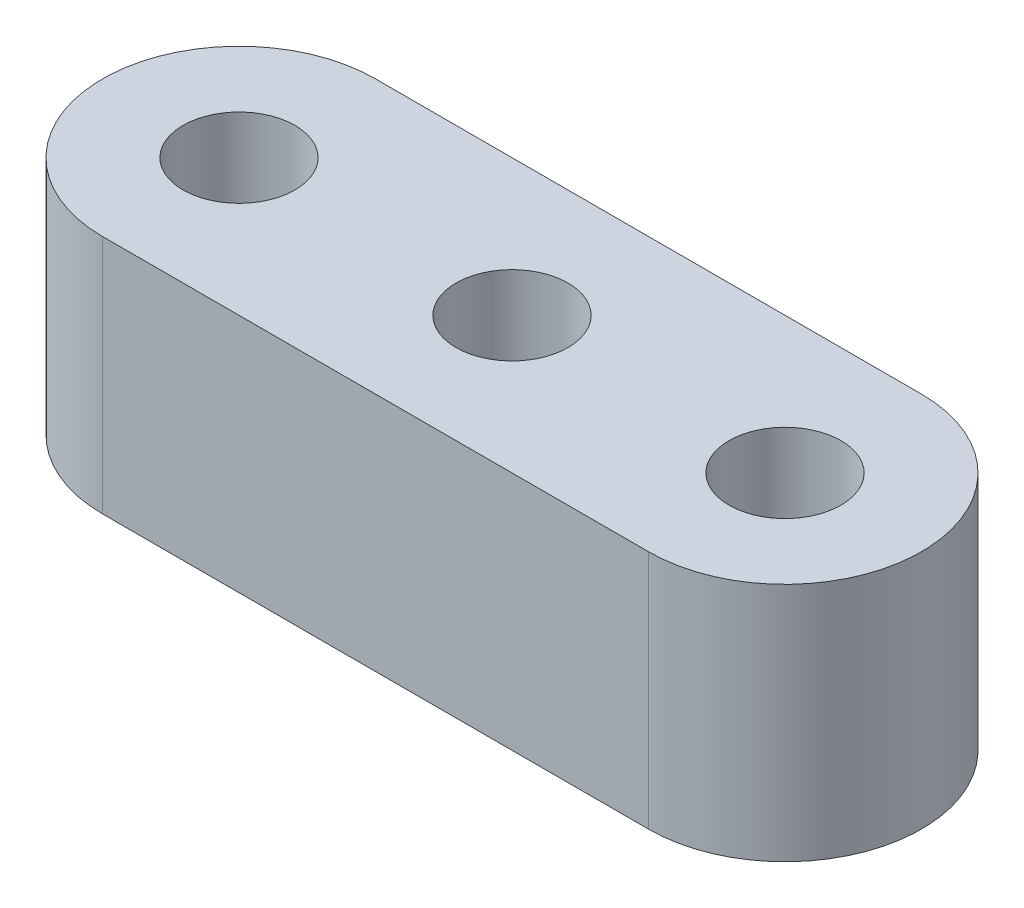
ISO-10303-21;
HEADER;
FILE_DESCRIPTION(('STEP AP214'),'2;1');
FILE_NAME('part.step','',(''),(''),'','','');
FILE_SCHEMA(('AUTOMOTIVE_DESIGN { 1 0 10303 214 1 1 1 1 }'));
ENDSEC;
DATA;
#1=APPLICATION_CONTEXT('core data for automotive mechanical design processes');
#2=APPLICATION_PROTOCOL_DEFINITION('international standard','automotive_design',2000,#1);
#3=PRODUCT_CONTEXT('',#1,'mechanical');
#4=PRODUCT('Part','Part','',(#3));
#5=PRODUCT_RELATED_PRODUCT_CATEGORY('part','',(#4));
#6=PRODUCT_DEFINITION_FORMATION('','',#4);
#7=PRODUCT_DEFINITION_CONTEXT('part definition',#1,'design');
#8=PRODUCT_DEFINITION('design','',#6,#7);
#9=PRODUCT_DEFINITION_SHAPE('','',#8);
#10=(LENGTH_UNIT() NAMED_UNIT(*) SI_UNIT(.MILLI.,.METRE.));
#11=(NAMED_UNIT(*) PLANE_ANGLE_UNIT() SI_UNIT($,.RADIAN.));
#12=(NAMED_UNIT(*) SI_UNIT($,.STERADIAN.) SOLID_ANGLE_UNIT());
#13=UNCERTAINTY_MEASURE_WITH_UNIT(LENGTH_MEASURE(1.E-05),#10,'distance_accuracy_value','');
#14=(GEOMETRIC_REPRESENTATION_CONTEXT(3) GLOBAL_UNCERTAINTY_ASSIGNED_CONTEXT((#13)) GLOBAL_UNIT_ASSIGNED_CONTEXT((#10,
#11,#12)) REPRESENTATION_CONTEXT('',''));
#15=CARTESIAN_POINT('',(0.,0.,0.));
#16=DIRECTION('',(0.,0.,1.));
#17=DIRECTION('',(1.,0.,0.));
#18=AXIS2_PLACEMENT_3D('',#15,#16,#17);
#19=CARTESIAN_POINT('',(-10.,4.4,5.));
#20=DIRECTION('',(0.,1.,0.));
#21=DIRECTION('',(0.,0.,1.));
#22=AXIS2_PLACEMENT_3D('',#19,#20,#21);
#23=PLANE('',#22);
#24=CARTESIAN_POINT('',(-10.,4.4,5.));
#25=DIRECTION('',(0.,1.,0.));
#26=DIRECTION('',(0.,0.,-1.));
#27=AXIS2_PLACEMENT_3D('',#24,#25,#26);
#28=CIRCLE('',#27,2.05);
#29=CARTESIAN_POINT('',(-10.,4.4,2.95));
#30=VERTEX_POINT('',#29);
#31=EDGE_CURVE('E136',#30,#30,#28,.T.);
#32=ORIENTED_EDGE('',*,*,#31,.F.);
#33=EDGE_LOOP('',(#32));
#34=FACE_BOUND('',#33,.T.);
#35=CARTESIAN_POINT('',(-10.,4.4,5.));
#36=DIRECTION('',(0.,1.,0.));
#37=DIRECTION('',(0.,0.,1.));
#38=AXIS2_PLACEMENT_3D('',#35,#36,#37);
#39=CIRCLE('',#38,5.);
#40=CARTESIAN_POINT('',(-10.,4.4,0.));
#41=VERTEX_POINT('',#40);
#42=CARTESIAN_POINT('',(-10.,4.4,10.));
#43=VERTEX_POINT('',#42);
#44=EDGE_CURVE('E95',#41,#43,#39,.T.);
#45=ORIENTED_EDGE('',*,*,#44,.T.);
#46=DIRECTION('',(1.,0.,0.));
#47=VECTOR('',#46,1.);
#48=CARTESIAN_POINT('',(-10.,4.4,10.));
#49=LINE('',#48,#47);
#50=CARTESIAN_POINT('',(10.,4.4,10.));
#51=VERTEX_POINT('',#50);
#52=EDGE_CURVE('E89',#43,#51,#49,.T.);
#53=ORIENTED_EDGE('',*,*,#52,.T.);
#54=CARTESIAN_POINT('',(10.,4.4,5.));
#55=DIRECTION('',(0.,1.,0.));
#56=DIRECTION('',(0.,0.,1.));
#57=AXIS2_PLACEMENT_3D('',#54,#55,#56);
#58=CIRCLE('',#57,5.);
#59=CARTESIAN_POINT('',(10.,4.4,0.));
#60=VERTEX_POINT('',#59);
#61=EDGE_CURVE('E92',#51,#60,#58,.T.);
#62=ORIENTED_EDGE('',*,*,#61,.T.);
#63=DIRECTION('',(-1.,0.,0.));
#64=VECTOR('',#63,1.);
#65=CARTESIAN_POINT('',(5.,4.4,0.));
#66=LINE('',#65,#64);
#67=EDGE_CURVE('E61',#60,#41,#66,.T.);
#68=ORIENTED_EDGE('',*,*,#67,.T.);
#69=EDGE_LOOP('',(#45,#53,#62,#68));
#70=FACE_BOUND('',#69,.T.);
#71=CARTESIAN_POINT('',(10.,4.4,5.));
#72=DIRECTION('',(0.,1.,0.));
#73=DIRECTION('',(0.,0.,1.));
#74=AXIS2_PLACEMENT_3D('',#71,#72,#73);
#75=CIRCLE('',#74,2.05);
#76=CARTESIAN_POINT('',(10.,4.4,7.05));
#77=VERTEX_POINT('',#76);
#78=EDGE_CURVE('E117',#77,#77,#75,.T.);
#79=ORIENTED_EDGE('',*,*,#78,.F.);
#80=EDGE_LOOP('',(#79));
#81=FACE_BOUND('',#80,.T.);
#82=CARTESIAN_POINT('',(0.,4.4,5.));
#83=DIRECTION('',(0.,1.,0.));
#84=DIRECTION('',(0.,0.,1.));
#85=AXIS2_PLACEMENT_3D('',#82,#83,#84);
#86=CIRCLE('',#85,2.05);
#87=CARTESIAN_POINT('',(0.,4.4,7.05));
#88=VERTEX_POINT('',#87);
#89=EDGE_CURVE('E144',#88,#88,#86,.T.);
#90=ORIENTED_EDGE('',*,*,#89,.F.);
#91=EDGE_LOOP('',(#90));
#92=FACE_BOUND('',#91,.T.);
#93=ADVANCED_FACE('F43',(#34,#70,#81,#92),#23,.T.);
#94=CARTESIAN_POINT('',(-10.,-4.4,5.));
#95=DIRECTION('',(0.,1.,0.));
#96=DIRECTION('',(0.,0.,1.));
#97=AXIS2_PLACEMENT_3D('',#94,#95,#96);
#98=PLANE('',#97);
#99=CARTESIAN_POINT('',(-10.,-4.4,5.));
#100=DIRECTION('',(0.,1.,0.));
#101=DIRECTION('',(0.,0.,1.));
#102=AXIS2_PLACEMENT_3D('',#99,#100,#101);
#103=CIRCLE('',#102,5.);
#104=CARTESIAN_POINT('',(-10.,-4.4,0.));
#105=VERTEX_POINT('',#104);
#106=CARTESIAN_POINT('',(-10.,-4.4,10.));
#107=VERTEX_POINT('',#106);
#108=EDGE_CURVE('E113',#105,#107,#103,.T.);
#109=ORIENTED_EDGE('',*,*,#108,.F.);
#110=DIRECTION('',(-1.,0.,0.));
#111=VECTOR('',#110,1.);
#112=CARTESIAN_POINT('',(-10.,-4.4,0.));
#113=LINE('',#112,#111);
#114=CARTESIAN_POINT('',(10.,-4.4,0.));
#115=VERTEX_POINT('',#114);
#116=EDGE_CURVE('E78',#115,#105,#113,.T.);
#117=ORIENTED_EDGE('',*,*,#116,.F.);
#118=CARTESIAN_POINT('',(10.,-4.4,5.));
#119=DIRECTION('',(0.,1.,0.));
#120=DIRECTION('',(0.,0.,1.));
#121=AXIS2_PLACEMENT_3D('',#118,#119,#120);
#122=CIRCLE('',#121,5.);
#123=CARTESIAN_POINT('',(10.,-4.4,10.));
#124=VERTEX_POINT('',#123);
#125=EDGE_CURVE('E120',#124,#115,#122,.T.);
#126=ORIENTED_EDGE('',*,*,#125,.F.);
#127=DIRECTION('',(1.,0.,0.));
#128=VECTOR('',#127,1.);
#129=CARTESIAN_POINT('',(5.,-4.4,10.));
#130=LINE('',#129,#128);
#131=EDGE_CURVE('E101',#107,#124,#130,.T.);
#132=ORIENTED_EDGE('',*,*,#131,.F.);
#133=EDGE_LOOP('',(#109,#117,#126,#132));
#134=FACE_BOUND('',#133,.T.);
#135=CARTESIAN_POINT('',(10.,-4.4,5.));
#136=DIRECTION('',(0.,1.,0.));
#137=DIRECTION('',(0.,0.,1.));
#138=AXIS2_PLACEMENT_3D('',#135,#136,#137);
#139=CIRCLE('',#138,2.05);
#140=CARTESIAN_POINT('',(10.,-4.4,7.05));
#141=VERTEX_POINT('',#140);
#142=EDGE_CURVE('E132',#141,#141,#139,.T.);
#143=ORIENTED_EDGE('',*,*,#142,.T.);
#144=EDGE_LOOP('',(#143));
#145=FACE_BOUND('',#144,.T.);
#146=CARTESIAN_POINT('',(-10.,-4.4,5.));
#147=DIRECTION('',(0.,1.,0.));
#148=DIRECTION('',(0.,0.,-1.));
#149=AXIS2_PLACEMENT_3D('',#146,#147,#148);
#150=CIRCLE('',#149,2.05);
#151=CARTESIAN_POINT('',(-10.,-4.4,2.95));
#152=VERTEX_POINT('',#151);
#153=EDGE_CURVE('E140',#152,#152,#150,.T.);
#154=ORIENTED_EDGE('',*,*,#153,.T.);
#155=EDGE_LOOP('',(#154));
#156=FACE_BOUND('',#155,.T.);
#157=CARTESIAN_POINT('',(0.,-4.4,5.));
#158=DIRECTION('',(0.,1.,0.));
#159=DIRECTION('',(0.,0.,1.));
#160=AXIS2_PLACEMENT_3D('',#157,#158,#159);
#161=CIRCLE('',#160,2.05);
#162=CARTESIAN_POINT('',(0.,-4.4,7.05));
#163=VERTEX_POINT('',#162);
#164=EDGE_CURVE('E148',#163,#163,#161,.T.);
#165=ORIENTED_EDGE('',*,*,#164,.T.);
#166=EDGE_LOOP('',(#165));
#167=FACE_BOUND('',#166,.T.);
#168=ADVANCED_FACE('F160',(#134,#145,#156,#167),#98,.F.);
#169=CARTESIAN_POINT('',(-10.,4.4,5.));
#170=DIRECTION('',(0.,-1.,0.));
#171=DIRECTION('',(0.,0.,-1.));
#172=AXIS2_PLACEMENT_3D('',#169,#170,#171);
#173=CYLINDRICAL_SURFACE('',#172,5.);
#174=ORIENTED_EDGE('',*,*,#108,.T.);
#175=DIRECTION('',(0.,-1.,0.));
#176=VECTOR('',#175,1.);
#177=CARTESIAN_POINT('',(-10.,4.4,10.));
#178=LINE('',#177,#176);
#179=EDGE_CURVE('E11',#43,#107,#178,.T.);
#180=ORIENTED_EDGE('',*,*,#179,.F.);
#181=ORIENTED_EDGE('',*,*,#44,.F.);
#182=DIRECTION('',(0.,-1.,0.));
#183=VECTOR('',#182,1.);
#184=CARTESIAN_POINT('',(-10.,4.4,0.));
#185=LINE('',#184,#183);
#186=EDGE_CURVE('E109',#41,#105,#185,.T.);
#187=ORIENTED_EDGE('',*,*,#186,.T.);
#188=EDGE_LOOP('',(#174,#180,#181,#187));
#189=FACE_BOUND('',#188,.T.);
#190=ADVANCED_FACE('F45',(#189),#173,.T.);
#191=CARTESIAN_POINT('',(5.,4.4,10.));
#192=DIRECTION('',(0.,0.,-1.));
#193=DIRECTION('',(-1.,0.,0.));
#194=AXIS2_PLACEMENT_3D('',#191,#192,#193);
#195=PLANE('',#194);
#196=ORIENTED_EDGE('',*,*,#131,.T.);
#197=DIRECTION('',(0.,-1.,0.));
#198=VECTOR('',#197,1.);
#199=CARTESIAN_POINT('',(10.,4.4,10.));
#200=LINE('',#199,#198);
#201=EDGE_CURVE('E53',#51,#124,#200,.T.);
#202=ORIENTED_EDGE('',*,*,#201,.F.);
#203=ORIENTED_EDGE('',*,*,#52,.F.);
#204=ORIENTED_EDGE('',*,*,#179,.T.);
#205=EDGE_LOOP('',(#196,#202,#203,#204));
#206=FACE_BOUND('',#205,.T.);
#207=ADVANCED_FACE('F100',(#206),#195,.F.);
#208=CARTESIAN_POINT('',(10.,4.4,5.));
#209=DIRECTION('',(0.,-1.,0.));
#210=DIRECTION('',(0.,0.,-1.));
#211=AXIS2_PLACEMENT_3D('',#208,#209,#210);
#212=CYLINDRICAL_SURFACE('',#211,5.);
#213=ORIENTED_EDGE('',*,*,#125,.T.);
#214=DIRECTION('',(0.,-1.,0.));
#215=VECTOR('',#214,1.);
#216=CARTESIAN_POINT('',(10.,4.4,0.));
#217=LINE('',#216,#215);
#218=EDGE_CURVE('E104',#60,#115,#217,.T.);
#219=ORIENTED_EDGE('',*,*,#218,.F.);
#220=ORIENTED_EDGE('',*,*,#61,.F.);
#221=ORIENTED_EDGE('',*,*,#201,.T.);
#222=EDGE_LOOP('',(#213,#219,#220,#221));
#223=FACE_BOUND('',#222,.T.);
#224=ADVANCED_FACE('F105',(#223),#212,.T.);
#225=CARTESIAN_POINT('',(-10.,4.4,0.));
#226=DIRECTION('',(0.,0.,1.));
#227=DIRECTION('',(1.,0.,0.));
#228=AXIS2_PLACEMENT_3D('',#225,#226,#227);
#229=PLANE('',#228);
#230=ORIENTED_EDGE('',*,*,#116,.T.);
#231=ORIENTED_EDGE('',*,*,#186,.F.);
#232=ORIENTED_EDGE('',*,*,#67,.F.);
#233=ORIENTED_EDGE('',*,*,#218,.T.);
#234=EDGE_LOOP('',(#230,#231,#232,#233));
#235=FACE_BOUND('',#234,.T.);
#236=ADVANCED_FACE('F128',(#235),#229,.F.);
#237=CARTESIAN_POINT('',(10.,4.4,5.));
#238=DIRECTION('',(0.,-1.,0.));
#239=DIRECTION('',(0.,0.,-1.));
#240=AXIS2_PLACEMENT_3D('',#237,#238,#239);
#241=CYLINDRICAL_SURFACE('',#240,2.05);
#242=ORIENTED_EDGE('',*,*,#78,.T.);
#243=EDGE_LOOP('',(#242));
#244=FACE_BOUND('',#243,.T.);
#245=ORIENTED_EDGE('',*,*,#142,.F.);
#246=EDGE_LOOP('',(#245));
#247=FACE_BOUND('',#246,.T.);
#248=ADVANCED_FACE('F169',(#244,#247),#241,.F.);
#249=CARTESIAN_POINT('',(-10.,4.4,5.));
#250=DIRECTION('',(0.,-1.,0.));
#251=DIRECTION('',(0.,0.,-1.));
#252=AXIS2_PLACEMENT_3D('',#249,#250,#251);
#253=CYLINDRICAL_SURFACE('',#252,2.05);
#254=ORIENTED_EDGE('',*,*,#31,.T.);
#255=EDGE_LOOP('',(#254));
#256=FACE_BOUND('',#255,.T.);
#257=ORIENTED_EDGE('',*,*,#153,.F.);
#258=EDGE_LOOP('',(#257));
#259=FACE_BOUND('',#258,.T.);
#260=ADVANCED_FACE('F225',(#256,#259),#253,.F.);
#261=CARTESIAN_POINT('',(0.,4.4,5.));
#262=DIRECTION('',(0.,-1.,0.));
#263=DIRECTION('',(0.,0.,-1.));
#264=AXIS2_PLACEMENT_3D('',#261,#262,#263);
#265=CYLINDRICAL_SURFACE('',#264,2.05);
#266=ORIENTED_EDGE('',*,*,#89,.T.);
#267=EDGE_LOOP('',(#266));
#268=FACE_BOUND('',#267,.T.);
#269=ORIENTED_EDGE('',*,*,#164,.F.);
#270=EDGE_LOOP('',(#269));
#271=FACE_BOUND('',#270,.T.);
#272=ADVANCED_FACE('F156',(#268,#271),#265,.F.);
#273=CLOSED_SHELL('',(#93,#168,#190,#207,#224,#236,#248,#260,#272));
#274=MANIFOLD_SOLID_BREP('B2',#273);
#275=ADVANCED_BREP_SHAPE_REPRESENTATION('',(#18,#274),#14);
#276=SHAPE_DEFINITION_REPRESENTATION(#9,#275);
ENDSEC;
END-ISO-10303-21;
